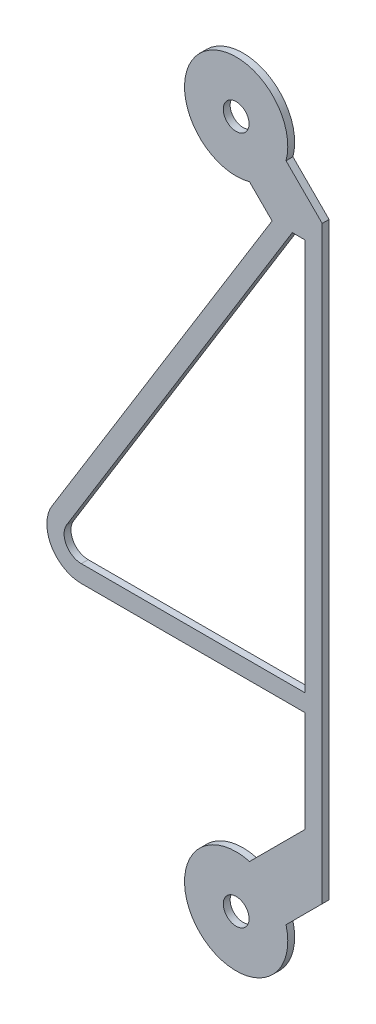
ISO-10303-21;
HEADER;
FILE_DESCRIPTION(('STEP AP214'),'2;1');
FILE_NAME('part.step','',(''),(''),'','','');
FILE_SCHEMA(('AUTOMOTIVE_DESIGN { 1 0 10303 214 1 1 1 1 }'));
ENDSEC;
DATA;
#1=APPLICATION_CONTEXT('core data for automotive mechanical design processes');
#2=APPLICATION_PROTOCOL_DEFINITION('international standard','automotive_design',2000,#1);
#3=PRODUCT_CONTEXT('',#1,'mechanical');
#4=PRODUCT('Part','Part','',(#3));
#5=PRODUCT_RELATED_PRODUCT_CATEGORY('part','',(#4));
#6=PRODUCT_DEFINITION_FORMATION('','',#4);
#7=PRODUCT_DEFINITION_CONTEXT('part definition',#1,'design');
#8=PRODUCT_DEFINITION('design','',#6,#7);
#9=PRODUCT_DEFINITION_SHAPE('','',#8);
#10=(LENGTH_UNIT() NAMED_UNIT(*) SI_UNIT(.MILLI.,.METRE.));
#11=(NAMED_UNIT(*) PLANE_ANGLE_UNIT() SI_UNIT($,.RADIAN.));
#12=(NAMED_UNIT(*) SI_UNIT($,.STERADIAN.) SOLID_ANGLE_UNIT());
#13=UNCERTAINTY_MEASURE_WITH_UNIT(LENGTH_MEASURE(1.E-05),#10,'distance_accuracy_value','');
#14=(GEOMETRIC_REPRESENTATION_CONTEXT(3) GLOBAL_UNCERTAINTY_ASSIGNED_CONTEXT((#13)) GLOBAL_UNIT_ASSIGNED_CONTEXT((#10,
#11,#12)) REPRESENTATION_CONTEXT('',''));
#15=CARTESIAN_POINT('',(0.,0.,0.));
#16=DIRECTION('',(0.,0.,1.));
#17=DIRECTION('',(1.,0.,0.));
#18=AXIS2_PLACEMENT_3D('',#15,#16,#17);
#19=CARTESIAN_POINT('',(0.,-10.,0.1));
#20=DIRECTION('',(0.,0.,1.));
#21=DIRECTION('',(1.,0.,0.));
#22=AXIS2_PLACEMENT_3D('',#19,#20,#21);
#23=PLANE('',#22);
#24=CARTESIAN_POINT('',(0.,10.,0.1));
#25=DIRECTION('',(0.,0.,1.));
#26=DIRECTION('',(1.,0.,0.));
#27=AXIS2_PLACEMENT_3D('',#24,#25,#26);
#28=CIRCLE('',#27,0.375);
#29=CARTESIAN_POINT('',(0.375,10.,0.1));
#30=VERTEX_POINT('',#29);
#31=EDGE_CURVE('E198',#30,#30,#28,.T.);
#32=ORIENTED_EDGE('',*,*,#31,.F.);
#33=EDGE_LOOP('',(#32));
#34=FACE_BOUND('',#33,.T.);
#35=DIRECTION('',(0.,-1.,0.));
#36=VECTOR('',#35,1.);
#37=CARTESIAN_POINT('',(2.,-4.,0.1));
#38=LINE('',#37,#36);
#39=CARTESIAN_POINT('',(2.,-4.,0.1));
#40=VERTEX_POINT('',#39);
#41=CARTESIAN_POINT('',(2.,-6.93933982822024,0.1));
#42=VERTEX_POINT('',#41);
#43=EDGE_CURVE('E204',#40,#42,#38,.T.);
#44=ORIENTED_EDGE('',*,*,#43,.T.);
#45=DIRECTION('',(-0.70710678118655,-0.707106781186545,0.));
#46=VECTOR('',#45,1.);
#47=CARTESIAN_POINT('',(2.,-6.93933982822024,0.1));
#48=LINE('',#47,#46);
#49=CARTESIAN_POINT('',(0.388228567653822,-8.55111126056641,0.1));
#50=VERTEX_POINT('',#49);
#51=EDGE_CURVE('E207',#42,#50,#48,.T.);
#52=ORIENTED_EDGE('',*,*,#51,.T.);
#53=CARTESIAN_POINT('',(0.,-10.,0.1));
#54=DIRECTION('',(0.,0.,1.));
#55=DIRECTION('',(1.,0.,0.));
#56=AXIS2_PLACEMENT_3D('',#53,#54,#55);
#57=CIRCLE('',#56,1.5);
#58=CARTESIAN_POINT('',(1.4488887394336,-9.61177143234619,0.1));
#59=VERTEX_POINT('',#58);
#60=EDGE_CURVE('E210',#50,#59,#57,.T.);
#61=ORIENTED_EDGE('',*,*,#60,.T.);
#62=DIRECTION('',(0.707106781186551,0.707106781186544,0.));
#63=VECTOR('',#62,1.);
#64=CARTESIAN_POINT('',(2.5,-8.5606601717798,0.1));
#65=LINE('',#64,#63);
#66=CARTESIAN_POINT('',(2.5,-8.5606601717798,0.1));
#67=VERTEX_POINT('',#66);
#68=EDGE_CURVE('E212',#59,#67,#65,.T.);
#69=ORIENTED_EDGE('',*,*,#68,.T.);
#70=DIRECTION('',(0.,1.,0.));
#71=VECTOR('',#70,1.);
#72=CARTESIAN_POINT('',(2.5,-8.5606601717798,0.1));
#73=LINE('',#72,#71);
#74=CARTESIAN_POINT('',(2.5,8.5606601717798,0.1));
#75=VERTEX_POINT('',#74);
#76=EDGE_CURVE('E214',#67,#75,#73,.T.);
#77=ORIENTED_EDGE('',*,*,#76,.T.);
#78=DIRECTION('',(-0.707106781186544,0.707106781186551,0.));
#79=VECTOR('',#78,1.);
#80=CARTESIAN_POINT('',(2.5,8.5606601717798,0.1));
#81=LINE('',#80,#79);
#82=CARTESIAN_POINT('',(1.4488887394336,9.61177143234621,0.1));
#83=VERTEX_POINT('',#82);
#84=EDGE_CURVE('E216',#75,#83,#81,.T.);
#85=ORIENTED_EDGE('',*,*,#84,.T.);
#86=CARTESIAN_POINT('',(0.,10.,0.1));
#87=DIRECTION('',(0.,0.,1.));
#88=DIRECTION('',(1.,0.,0.));
#89=AXIS2_PLACEMENT_3D('',#86,#87,#88);
#90=CIRCLE('',#89,1.5);
#91=CARTESIAN_POINT('',(0.388228567653776,8.5511112605664,0.1));
#92=VERTEX_POINT('',#91);
#93=EDGE_CURVE('E218',#83,#92,#90,.T.);
#94=ORIENTED_EDGE('',*,*,#93,.T.);
#95=DIRECTION('',(0.707106781186544,-0.707106781186551,0.));
#96=VECTOR('',#95,1.);
#97=CARTESIAN_POINT('',(1.04409718951556,7.8952426387046,0.1));
#98=LINE('',#97,#96);
#99=CARTESIAN_POINT('',(1.04409718951556,7.8952426387046,0.1));
#100=VERTEX_POINT('',#99);
#101=EDGE_CURVE('E220',#92,#100,#98,.T.);
#102=ORIENTED_EDGE('',*,*,#101,.T.);
#103=DIRECTION('',(-0.524901574807822,-0.851162931972645,0.));
#104=VECTOR('',#103,1.);
#105=CARTESIAN_POINT('',(1.04409718951556,7.8952426387046,0.1));
#106=LINE('',#105,#104);
#107=CARTESIAN_POINT('',(-5.35116293197264,-2.47509842519218,0.1));
#108=VERTEX_POINT('',#107);
#109=EDGE_CURVE('E222',#100,#108,#106,.T.);
#110=ORIENTED_EDGE('',*,*,#109,.T.);
#111=CARTESIAN_POINT('',(-4.5,-3.,0.1));
#112=DIRECTION('',(0.,0.,1.));
#113=DIRECTION('',(1.,0.,0.));
#114=AXIS2_PLACEMENT_3D('',#111,#112,#113);
#115=CIRCLE('',#114,1.);
#116=CARTESIAN_POINT('',(-4.5,-4.,0.1));
#117=VERTEX_POINT('',#116);
#118=EDGE_CURVE('E224',#108,#117,#115,.T.);
#119=ORIENTED_EDGE('',*,*,#118,.T.);
#120=DIRECTION('',(1.,0.,0.));
#121=VECTOR('',#120,1.);
#122=CARTESIAN_POINT('',(-4.5,-4.,0.1));
#123=LINE('',#122,#121);
#124=EDGE_CURVE('E226',#117,#40,#123,.T.);
#125=ORIENTED_EDGE('',*,*,#124,.T.);
#126=EDGE_LOOP('',(#44,#52,#61,#69,#77,#85,#94,#102,#110,#119,#125));
#127=FACE_BOUND('',#126,.T.);
#128=CARTESIAN_POINT('',(0.,-10.,0.1));
#129=DIRECTION('',(0.,0.,1.));
#130=DIRECTION('',(1.,0.,0.));
#131=AXIS2_PLACEMENT_3D('',#128,#129,#130);
#132=CIRCLE('',#131,0.375);
#133=CARTESIAN_POINT('',(0.375000000000006,-10.,0.1));
#134=VERTEX_POINT('',#133);
#135=EDGE_CURVE('E192',#134,#134,#132,.T.);
#136=ORIENTED_EDGE('',*,*,#135,.F.);
#137=EDGE_LOOP('',(#136));
#138=FACE_BOUND('',#137,.T.);
#139=DIRECTION('',(1.,0.,0.));
#140=VECTOR('',#139,1.);
#141=CARTESIAN_POINT('',(-4.5,-3.5,0.1));
#142=LINE('',#141,#140);
#143=CARTESIAN_POINT('',(-4.5,-3.5,0.1));
#144=VERTEX_POINT('',#143);
#145=CARTESIAN_POINT('',(2.,-3.5,0.1));
#146=VERTEX_POINT('',#145);
#147=EDGE_CURVE('E156',#144,#146,#142,.T.);
#148=ORIENTED_EDGE('',*,*,#147,.F.);
#149=CARTESIAN_POINT('',(-4.5,-3.,0.1));
#150=DIRECTION('',(0.,0.,1.));
#151=DIRECTION('',(1.,0.,0.));
#152=AXIS2_PLACEMENT_3D('',#149,#150,#151);
#153=CIRCLE('',#152,0.5);
#154=CARTESIAN_POINT('',(-4.92558146598632,-2.73754921259609,0.1));
#155=VERTEX_POINT('',#154);
#156=EDGE_CURVE('E148',#155,#144,#153,.T.);
#157=ORIENTED_EDGE('',*,*,#156,.F.);
#158=DIRECTION('',(-0.524901574807822,-0.851162931972645,0.));
#159=VECTOR('',#158,1.);
#160=CARTESIAN_POINT('',(1.63152878600345,7.8952426387046,0.1));
#161=LINE('',#160,#159);
#162=CARTESIAN_POINT('',(1.63152878600345,7.8952426387046,0.1));
#163=VERTEX_POINT('',#162);
#164=EDGE_CURVE('E175',#163,#155,#161,.T.);
#165=ORIENTED_EDGE('',*,*,#164,.F.);
#166=DIRECTION('',(-1.,0.,0.));
#167=VECTOR('',#166,1.);
#168=CARTESIAN_POINT('',(1.63152878600345,7.8952426387046,0.1));
#169=LINE('',#168,#167);
#170=CARTESIAN_POINT('',(2.,7.8952426387046,0.1));
#171=VERTEX_POINT('',#170);
#172=EDGE_CURVE('E171',#171,#163,#169,.T.);
#173=ORIENTED_EDGE('',*,*,#172,.F.);
#174=DIRECTION('',(0.,1.,0.));
#175=VECTOR('',#174,1.);
#176=CARTESIAN_POINT('',(2.,-3.5,0.1));
#177=LINE('',#176,#175);
#178=EDGE_CURVE('E169',#146,#171,#177,.T.);
#179=ORIENTED_EDGE('',*,*,#178,.F.);
#180=EDGE_LOOP('',(#148,#157,#165,#173,#179));
#181=FACE_BOUND('',#180,.T.);
#182=ADVANCED_FACE('F35',(#34,#127,#138,#181),#23,.T.);
#183=CARTESIAN_POINT('',(0.,-10.,-0.1));
#184=DIRECTION('',(0.,0.,1.));
#185=DIRECTION('',(1.,0.,0.));
#186=AXIS2_PLACEMENT_3D('',#183,#184,#185);
#187=PLANE('',#186);
#188=CARTESIAN_POINT('',(0.,-10.,-0.1));
#189=DIRECTION('',(0.,0.,1.));
#190=DIRECTION('',(1.,0.,0.));
#191=AXIS2_PLACEMENT_3D('',#188,#189,#190);
#192=CIRCLE('',#191,0.375);
#193=CARTESIAN_POINT('',(0.375000000000006,-10.,-0.1));
#194=VERTEX_POINT('',#193);
#195=EDGE_CURVE('E164',#194,#194,#192,.T.);
#196=ORIENTED_EDGE('',*,*,#195,.T.);
#197=EDGE_LOOP('',(#196));
#198=FACE_BOUND('',#197,.T.);
#199=CARTESIAN_POINT('',(0.,10.,-0.1));
#200=DIRECTION('',(0.,0.,1.));
#201=DIRECTION('',(1.,0.,0.));
#202=AXIS2_PLACEMENT_3D('',#199,#200,#201);
#203=CIRCLE('',#202,0.375);
#204=CARTESIAN_POINT('',(0.375,10.,-0.1));
#205=VERTEX_POINT('',#204);
#206=EDGE_CURVE('E195',#205,#205,#203,.T.);
#207=ORIENTED_EDGE('',*,*,#206,.T.);
#208=EDGE_LOOP('',(#207));
#209=FACE_BOUND('',#208,.T.);
#210=DIRECTION('',(0.,-1.,0.));
#211=VECTOR('',#210,1.);
#212=CARTESIAN_POINT('',(2.,-4.,-0.1));
#213=LINE('',#212,#211);
#214=CARTESIAN_POINT('',(2.,-4.,-0.1));
#215=VERTEX_POINT('',#214);
#216=CARTESIAN_POINT('',(2.,-6.93933982822024,-0.1));
#217=VERTEX_POINT('',#216);
#218=EDGE_CURVE('E201',#215,#217,#213,.T.);
#219=ORIENTED_EDGE('',*,*,#218,.F.);
#220=DIRECTION('',(1.,0.,0.));
#221=VECTOR('',#220,1.);
#222=CARTESIAN_POINT('',(-4.5,-4.,-0.1));
#223=LINE('',#222,#221);
#224=CARTESIAN_POINT('',(-4.5,-4.,-0.1));
#225=VERTEX_POINT('',#224);
#226=EDGE_CURVE('E208',#225,#215,#223,.T.);
#227=ORIENTED_EDGE('',*,*,#226,.F.);
#228=CARTESIAN_POINT('',(-4.5,-3.,-0.1));
#229=DIRECTION('',(0.,0.,1.));
#230=DIRECTION('',(1.,0.,0.));
#231=AXIS2_PLACEMENT_3D('',#228,#229,#230);
#232=CIRCLE('',#231,1.);
#233=CARTESIAN_POINT('',(-5.35116293197264,-2.47509842519218,-0.1));
#234=VERTEX_POINT('',#233);
#235=EDGE_CURVE('E247',#234,#225,#232,.T.);
#236=ORIENTED_EDGE('',*,*,#235,.F.);
#237=DIRECTION('',(-0.524901574807822,-0.851162931972645,0.));
#238=VECTOR('',#237,1.);
#239=CARTESIAN_POINT('',(1.04409718951556,7.8952426387046,-0.1));
#240=LINE('',#239,#238);
#241=CARTESIAN_POINT('',(1.04409718951556,7.8952426387046,-0.1));
#242=VERTEX_POINT('',#241);
#243=EDGE_CURVE('E245',#242,#234,#240,.T.);
#244=ORIENTED_EDGE('',*,*,#243,.F.);
#245=DIRECTION('',(0.707106781186544,-0.707106781186551,0.));
#246=VECTOR('',#245,1.);
#247=CARTESIAN_POINT('',(1.04409718951556,7.8952426387046,-0.1));
#248=LINE('',#247,#246);
#249=CARTESIAN_POINT('',(0.388228567653776,8.5511112605664,-0.1));
#250=VERTEX_POINT('',#249);
#251=EDGE_CURVE('E243',#250,#242,#248,.T.);
#252=ORIENTED_EDGE('',*,*,#251,.F.);
#253=CARTESIAN_POINT('',(0.,10.,-0.1));
#254=DIRECTION('',(0.,0.,1.));
#255=DIRECTION('',(1.,0.,0.));
#256=AXIS2_PLACEMENT_3D('',#253,#254,#255);
#257=CIRCLE('',#256,1.5);
#258=CARTESIAN_POINT('',(1.4488887394336,9.61177143234621,-0.1));
#259=VERTEX_POINT('',#258);
#260=EDGE_CURVE('E241',#259,#250,#257,.T.);
#261=ORIENTED_EDGE('',*,*,#260,.F.);
#262=DIRECTION('',(-0.707106781186544,0.707106781186551,0.));
#263=VECTOR('',#262,1.);
#264=CARTESIAN_POINT('',(2.5,8.5606601717798,-0.1));
#265=LINE('',#264,#263);
#266=CARTESIAN_POINT('',(2.5,8.5606601717798,-0.1));
#267=VERTEX_POINT('',#266);
#268=EDGE_CURVE('E239',#267,#259,#265,.T.);
#269=ORIENTED_EDGE('',*,*,#268,.F.);
#270=DIRECTION('',(0.,1.,0.));
#271=VECTOR('',#270,1.);
#272=CARTESIAN_POINT('',(2.5,-8.5606601717798,-0.1));
#273=LINE('',#272,#271);
#274=CARTESIAN_POINT('',(2.5,-8.5606601717798,-0.1));
#275=VERTEX_POINT('',#274);
#276=EDGE_CURVE('E237',#275,#267,#273,.T.);
#277=ORIENTED_EDGE('',*,*,#276,.F.);
#278=DIRECTION('',(0.707106781186551,0.707106781186544,0.));
#279=VECTOR('',#278,1.);
#280=CARTESIAN_POINT('',(2.5,-8.5606601717798,-0.1));
#281=LINE('',#280,#279);
#282=CARTESIAN_POINT('',(1.4488887394336,-9.61177143234619,-0.1));
#283=VERTEX_POINT('',#282);
#284=EDGE_CURVE('E235',#283,#275,#281,.T.);
#285=ORIENTED_EDGE('',*,*,#284,.F.);
#286=CARTESIAN_POINT('',(0.,-10.,-0.1));
#287=DIRECTION('',(0.,0.,1.));
#288=DIRECTION('',(1.,0.,0.));
#289=AXIS2_PLACEMENT_3D('',#286,#287,#288);
#290=CIRCLE('',#289,1.5);
#291=CARTESIAN_POINT('',(0.388228567653822,-8.55111126056641,-0.1));
#292=VERTEX_POINT('',#291);
#293=EDGE_CURVE('E233',#292,#283,#290,.T.);
#294=ORIENTED_EDGE('',*,*,#293,.F.);
#295=DIRECTION('',(-0.70710678118655,-0.707106781186545,0.));
#296=VECTOR('',#295,1.);
#297=CARTESIAN_POINT('',(2.,-6.93933982822024,-0.1));
#298=LINE('',#297,#296);
#299=EDGE_CURVE('E231',#217,#292,#298,.T.);
#300=ORIENTED_EDGE('',*,*,#299,.F.);
#301=EDGE_LOOP('',(#219,#227,#236,#244,#252,#261,#269,#277,#285,#294,#300));
#302=FACE_BOUND('',#301,.T.);
#303=CARTESIAN_POINT('',(-4.5,-3.,-0.1));
#304=DIRECTION('',(0.,0.,1.));
#305=DIRECTION('',(1.,0.,0.));
#306=AXIS2_PLACEMENT_3D('',#303,#304,#305);
#307=CIRCLE('',#306,0.5);
#308=CARTESIAN_POINT('',(-4.92558146598632,-2.73754921259609,-0.1));
#309=VERTEX_POINT('',#308);
#310=CARTESIAN_POINT('',(-4.5,-3.5,-0.1));
#311=VERTEX_POINT('',#310);
#312=EDGE_CURVE('E58',#309,#311,#307,.T.);
#313=ORIENTED_EDGE('',*,*,#312,.T.);
#314=DIRECTION('',(1.,0.,0.));
#315=VECTOR('',#314,1.);
#316=CARTESIAN_POINT('',(-4.5,-3.5,-0.1));
#317=LINE('',#316,#315);
#318=CARTESIAN_POINT('',(2.,-3.5,-0.1));
#319=VERTEX_POINT('',#318);
#320=EDGE_CURVE('E163',#311,#319,#317,.T.);
#321=ORIENTED_EDGE('',*,*,#320,.T.);
#322=DIRECTION('',(0.,1.,0.));
#323=VECTOR('',#322,1.);
#324=CARTESIAN_POINT('',(2.,-3.5,-0.1));
#325=LINE('',#324,#323);
#326=CARTESIAN_POINT('',(2.,7.8952426387046,-0.1));
#327=VERTEX_POINT('',#326);
#328=EDGE_CURVE('E179',#319,#327,#325,.T.);
#329=ORIENTED_EDGE('',*,*,#328,.T.);
#330=DIRECTION('',(-1.,0.,0.));
#331=VECTOR('',#330,1.);
#332=CARTESIAN_POINT('',(1.63152878600345,7.8952426387046,-0.1));
#333=LINE('',#332,#331);
#334=CARTESIAN_POINT('',(1.63152878600345,7.8952426387046,-0.1));
#335=VERTEX_POINT('',#334);
#336=EDGE_CURVE('E182',#327,#335,#333,.T.);
#337=ORIENTED_EDGE('',*,*,#336,.T.);
#338=DIRECTION('',(-0.524901574807822,-0.851162931972645,0.));
#339=VECTOR('',#338,1.);
#340=CARTESIAN_POINT('',(1.63152878600345,7.8952426387046,-0.1));
#341=LINE('',#340,#339);
#342=EDGE_CURVE('E157',#335,#309,#341,.T.);
#343=ORIENTED_EDGE('',*,*,#342,.T.);
#344=EDGE_LOOP('',(#313,#321,#329,#337,#343));
#345=FACE_BOUND('',#344,.T.);
#346=ADVANCED_FACE('F286',(#198,#209,#302,#345),#187,.F.);
#347=CARTESIAN_POINT('',(2.,-4.,0.1));
#348=DIRECTION('',(1.,0.,0.));
#349=DIRECTION('',(0.,0.,-1.));
#350=AXIS2_PLACEMENT_3D('',#347,#348,#349);
#351=PLANE('',#350);
#352=ORIENTED_EDGE('',*,*,#218,.T.);
#353=DIRECTION('',(0.,0.,-1.));
#354=VECTOR('',#353,1.);
#355=CARTESIAN_POINT('',(2.,-6.93933982822024,0.1));
#356=LINE('',#355,#354);
#357=EDGE_CURVE('E11',#42,#217,#356,.T.);
#358=ORIENTED_EDGE('',*,*,#357,.F.);
#359=ORIENTED_EDGE('',*,*,#43,.F.);
#360=DIRECTION('',(0.,0.,-1.));
#361=VECTOR('',#360,1.);
#362=CARTESIAN_POINT('',(2.,-4.,0.1));
#363=LINE('',#362,#361);
#364=EDGE_CURVE('E228',#40,#215,#363,.T.);
#365=ORIENTED_EDGE('',*,*,#364,.T.);
#366=EDGE_LOOP('',(#352,#358,#359,#365));
#367=FACE_BOUND('',#366,.T.);
#368=ADVANCED_FACE('F37',(#367),#351,.F.);
#369=CARTESIAN_POINT('',(2.,-6.93933982822024,0.1));
#370=DIRECTION('',(0.707106781186545,-0.70710678118655,0.));
#371=DIRECTION('',(0.70710678118655,0.707106781186545,0.));
#372=AXIS2_PLACEMENT_3D('',#369,#370,#371);
#373=PLANE('',#372);
#374=ORIENTED_EDGE('',*,*,#299,.T.);
#375=DIRECTION('',(0.,0.,-1.));
#376=VECTOR('',#375,1.);
#377=CARTESIAN_POINT('',(0.388228567653822,-8.55111126056641,0.1));
#378=LINE('',#377,#376);
#379=EDGE_CURVE('E43',#50,#292,#378,.T.);
#380=ORIENTED_EDGE('',*,*,#379,.F.);
#381=ORIENTED_EDGE('',*,*,#51,.F.);
#382=ORIENTED_EDGE('',*,*,#357,.T.);
#383=EDGE_LOOP('',(#374,#380,#381,#382));
#384=FACE_BOUND('',#383,.T.);
#385=ADVANCED_FACE('F304',(#384),#373,.F.);
#386=CARTESIAN_POINT('',(0.,-10.,0.1));
#387=DIRECTION('',(0.,0.,-1.));
#388=DIRECTION('',(-1.,0.,0.));
#389=AXIS2_PLACEMENT_3D('',#386,#387,#388);
#390=CYLINDRICAL_SURFACE('',#389,1.5);
#391=ORIENTED_EDGE('',*,*,#293,.T.);
#392=DIRECTION('',(0.,0.,-1.));
#393=VECTOR('',#392,1.);
#394=CARTESIAN_POINT('',(1.4488887394336,-9.61177143234619,0.1));
#395=LINE('',#394,#393);
#396=EDGE_CURVE('E273',#59,#283,#395,.T.);
#397=ORIENTED_EDGE('',*,*,#396,.F.);
#398=ORIENTED_EDGE('',*,*,#60,.F.);
#399=ORIENTED_EDGE('',*,*,#379,.T.);
#400=EDGE_LOOP('',(#391,#397,#398,#399));
#401=FACE_BOUND('',#400,.T.);
#402=ADVANCED_FACE('F280',(#401),#390,.T.);
#403=CARTESIAN_POINT('',(2.5,-8.5606601717798,0.1));
#404=DIRECTION('',(-0.707106781186544,0.707106781186551,0.));
#405=DIRECTION('',(-0.707106781186551,-0.707106781186544,0.));
#406=AXIS2_PLACEMENT_3D('',#403,#404,#405);
#407=PLANE('',#406);
#408=ORIENTED_EDGE('',*,*,#284,.T.);
#409=DIRECTION('',(0.,0.,-1.));
#410=VECTOR('',#409,1.);
#411=CARTESIAN_POINT('',(2.5,-8.5606601717798,0.1));
#412=LINE('',#411,#410);
#413=EDGE_CURVE('E270',#67,#275,#412,.T.);
#414=ORIENTED_EDGE('',*,*,#413,.F.);
#415=ORIENTED_EDGE('',*,*,#68,.F.);
#416=ORIENTED_EDGE('',*,*,#396,.T.);
#417=EDGE_LOOP('',(#408,#414,#415,#416));
#418=FACE_BOUND('',#417,.T.);
#419=ADVANCED_FACE('F292',(#418),#407,.F.);
#420=CARTESIAN_POINT('',(2.5,-8.5606601717798,0.1));
#421=DIRECTION('',(-1.,0.,0.));
#422=DIRECTION('',(0.,0.,1.));
#423=AXIS2_PLACEMENT_3D('',#420,#421,#422);
#424=PLANE('',#423);
#425=ORIENTED_EDGE('',*,*,#276,.T.);
#426=DIRECTION('',(0.,0.,-1.));
#427=VECTOR('',#426,1.);
#428=CARTESIAN_POINT('',(2.5,8.5606601717798,0.1));
#429=LINE('',#428,#427);
#430=EDGE_CURVE('E267',#75,#267,#429,.T.);
#431=ORIENTED_EDGE('',*,*,#430,.F.);
#432=ORIENTED_EDGE('',*,*,#76,.F.);
#433=ORIENTED_EDGE('',*,*,#413,.T.);
#434=EDGE_LOOP('',(#425,#431,#432,#433));
#435=FACE_BOUND('',#434,.T.);
#436=ADVANCED_FACE('F296',(#435),#424,.F.);
#437=CARTESIAN_POINT('',(2.5,8.5606601717798,0.1));
#438=DIRECTION('',(-0.707106781186551,-0.707106781186544,0.));
#439=DIRECTION('',(0.707106781186544,-0.707106781186551,0.));
#440=AXIS2_PLACEMENT_3D('',#437,#438,#439);
#441=PLANE('',#440);
#442=ORIENTED_EDGE('',*,*,#268,.T.);
#443=DIRECTION('',(0.,0.,-1.));
#444=VECTOR('',#443,1.);
#445=CARTESIAN_POINT('',(1.4488887394336,9.61177143234621,0.1));
#446=LINE('',#445,#444);
#447=EDGE_CURVE('E264',#83,#259,#446,.T.);
#448=ORIENTED_EDGE('',*,*,#447,.F.);
#449=ORIENTED_EDGE('',*,*,#84,.F.);
#450=ORIENTED_EDGE('',*,*,#430,.T.);
#451=EDGE_LOOP('',(#442,#448,#449,#450));
#452=FACE_BOUND('',#451,.T.);
#453=ADVANCED_FACE('F332',(#452),#441,.F.);
#454=CARTESIAN_POINT('',(0.,10.,0.1));
#455=DIRECTION('',(0.,0.,-1.));
#456=DIRECTION('',(-1.,0.,0.));
#457=AXIS2_PLACEMENT_3D('',#454,#455,#456);
#458=CYLINDRICAL_SURFACE('',#457,1.5);
#459=ORIENTED_EDGE('',*,*,#260,.T.);
#460=DIRECTION('',(0.,0.,-1.));
#461=VECTOR('',#460,1.);
#462=CARTESIAN_POINT('',(0.388228567653776,8.5511112605664,0.1));
#463=LINE('',#462,#461);
#464=EDGE_CURVE('E261',#92,#250,#463,.T.);
#465=ORIENTED_EDGE('',*,*,#464,.F.);
#466=ORIENTED_EDGE('',*,*,#93,.F.);
#467=ORIENTED_EDGE('',*,*,#447,.T.);
#468=EDGE_LOOP('',(#459,#465,#466,#467));
#469=FACE_BOUND('',#468,.T.);
#470=ADVANCED_FACE('F330',(#469),#458,.T.);
#471=CARTESIAN_POINT('',(1.04409718951556,7.8952426387046,0.1));
#472=DIRECTION('',(0.707106781186551,0.707106781186544,0.));
#473=DIRECTION('',(-0.707106781186544,0.707106781186551,0.));
#474=AXIS2_PLACEMENT_3D('',#471,#472,#473);
#475=PLANE('',#474);
#476=ORIENTED_EDGE('',*,*,#251,.T.);
#477=DIRECTION('',(0.,0.,-1.));
#478=VECTOR('',#477,1.);
#479=CARTESIAN_POINT('',(1.04409718951556,7.8952426387046,0.1));
#480=LINE('',#479,#478);
#481=EDGE_CURVE('E258',#100,#242,#480,.T.);
#482=ORIENTED_EDGE('',*,*,#481,.F.);
#483=ORIENTED_EDGE('',*,*,#101,.F.);
#484=ORIENTED_EDGE('',*,*,#464,.T.);
#485=EDGE_LOOP('',(#476,#482,#483,#484));
#486=FACE_BOUND('',#485,.T.);
#487=ADVANCED_FACE('F325',(#486),#475,.F.);
#488=CARTESIAN_POINT('',(1.04409718951556,7.8952426387046,0.1));
#489=DIRECTION('',(0.851162931972645,-0.524901574807821,0.));
#490=DIRECTION('',(0.524901574807822,0.851162931972645,0.));
#491=AXIS2_PLACEMENT_3D('',#488,#489,#490);
#492=PLANE('',#491);
#493=ORIENTED_EDGE('',*,*,#243,.T.);
#494=DIRECTION('',(0.,0.,-1.));
#495=VECTOR('',#494,1.);
#496=CARTESIAN_POINT('',(-5.35116293197264,-2.47509842519218,0.1));
#497=LINE('',#496,#495);
#498=EDGE_CURVE('E255',#108,#234,#497,.T.);
#499=ORIENTED_EDGE('',*,*,#498,.F.);
#500=ORIENTED_EDGE('',*,*,#109,.F.);
#501=ORIENTED_EDGE('',*,*,#481,.T.);
#502=EDGE_LOOP('',(#493,#499,#500,#501));
#503=FACE_BOUND('',#502,.T.);
#504=ADVANCED_FACE('F320',(#503),#492,.F.);
#505=CARTESIAN_POINT('',(-4.5,-3.,0.1));
#506=DIRECTION('',(0.,0.,-1.));
#507=DIRECTION('',(-1.,0.,0.));
#508=AXIS2_PLACEMENT_3D('',#505,#506,#507);
#509=CYLINDRICAL_SURFACE('',#508,1.);
#510=ORIENTED_EDGE('',*,*,#235,.T.);
#511=DIRECTION('',(0.,0.,-1.));
#512=VECTOR('',#511,1.);
#513=CARTESIAN_POINT('',(-4.5,-4.,0.1));
#514=LINE('',#513,#512);
#515=EDGE_CURVE('E252',#117,#225,#514,.T.);
#516=ORIENTED_EDGE('',*,*,#515,.F.);
#517=ORIENTED_EDGE('',*,*,#118,.F.);
#518=ORIENTED_EDGE('',*,*,#498,.T.);
#519=EDGE_LOOP('',(#510,#516,#517,#518));
#520=FACE_BOUND('',#519,.T.);
#521=ADVANCED_FACE('F316',(#520),#509,.T.);
#522=CARTESIAN_POINT('',(-4.5,-4.,0.1));
#523=DIRECTION('',(0.,1.,0.));
#524=DIRECTION('',(0.,0.,1.));
#525=AXIS2_PLACEMENT_3D('',#522,#523,#524);
#526=PLANE('',#525);
#527=ORIENTED_EDGE('',*,*,#226,.T.);
#528=ORIENTED_EDGE('',*,*,#364,.F.);
#529=ORIENTED_EDGE('',*,*,#124,.F.);
#530=ORIENTED_EDGE('',*,*,#515,.T.);
#531=EDGE_LOOP('',(#527,#528,#529,#530));
#532=FACE_BOUND('',#531,.T.);
#533=ADVANCED_FACE('F311',(#532),#526,.F.);
#534=CARTESIAN_POINT('',(0.,10.,0.1));
#535=DIRECTION('',(0.,0.,-1.));
#536=DIRECTION('',(-1.,0.,0.));
#537=AXIS2_PLACEMENT_3D('',#534,#535,#536);
#538=CYLINDRICAL_SURFACE('',#537,0.375);
#539=ORIENTED_EDGE('',*,*,#31,.T.);
#540=EDGE_LOOP('',(#539));
#541=FACE_BOUND('',#540,.T.);
#542=ORIENTED_EDGE('',*,*,#206,.F.);
#543=EDGE_LOOP('',(#542));
#544=FACE_BOUND('',#543,.T.);
#545=ADVANCED_FACE('F351',(#541,#544),#538,.F.);
#546=CARTESIAN_POINT('',(0.,-10.,0.1));
#547=DIRECTION('',(0.,0.,-1.));
#548=DIRECTION('',(-1.,0.,0.));
#549=AXIS2_PLACEMENT_3D('',#546,#547,#548);
#550=CYLINDRICAL_SURFACE('',#549,0.375);
#551=ORIENTED_EDGE('',*,*,#135,.T.);
#552=EDGE_LOOP('',(#551));
#553=FACE_BOUND('',#552,.T.);
#554=ORIENTED_EDGE('',*,*,#195,.F.);
#555=EDGE_LOOP('',(#554));
#556=FACE_BOUND('',#555,.T.);
#557=ADVANCED_FACE('F383',(#553,#556),#550,.F.);
#558=CARTESIAN_POINT('',(-4.5,-3.,0.1));
#559=DIRECTION('',(0.,0.,-1.));
#560=DIRECTION('',(-1.,0.,0.));
#561=AXIS2_PLACEMENT_3D('',#558,#559,#560);
#562=CYLINDRICAL_SURFACE('',#561,0.5);
#563=ORIENTED_EDGE('',*,*,#312,.F.);
#564=DIRECTION('',(0.,0.,-1.));
#565=VECTOR('',#564,1.);
#566=CARTESIAN_POINT('',(-4.92558146598632,-2.73754921259609,0.1));
#567=LINE('',#566,#565);
#568=EDGE_CURVE('E152',#155,#309,#567,.T.);
#569=ORIENTED_EDGE('',*,*,#568,.F.);
#570=ORIENTED_EDGE('',*,*,#156,.T.);
#571=DIRECTION('',(0.,0.,-1.));
#572=VECTOR('',#571,1.);
#573=CARTESIAN_POINT('',(-4.5,-3.5,0.1));
#574=LINE('',#573,#572);
#575=EDGE_CURVE('E151',#144,#311,#574,.T.);
#576=ORIENTED_EDGE('',*,*,#575,.T.);
#577=EDGE_LOOP('',(#563,#569,#570,#576));
#578=FACE_BOUND('',#577,.T.);
#579=ADVANCED_FACE('F150',(#578),#562,.F.);
#580=CARTESIAN_POINT('',(-4.5,-3.5,0.1));
#581=DIRECTION('',(0.,1.,0.));
#582=DIRECTION('',(0.,0.,1.));
#583=AXIS2_PLACEMENT_3D('',#580,#581,#582);
#584=PLANE('',#583);
#585=ORIENTED_EDGE('',*,*,#320,.F.);
#586=ORIENTED_EDGE('',*,*,#575,.F.);
#587=ORIENTED_EDGE('',*,*,#147,.T.);
#588=DIRECTION('',(0.,0.,-1.));
#589=VECTOR('',#588,1.);
#590=CARTESIAN_POINT('',(2.,-3.5,0.1));
#591=LINE('',#590,#589);
#592=EDGE_CURVE('E165',#146,#319,#591,.T.);
#593=ORIENTED_EDGE('',*,*,#592,.T.);
#594=EDGE_LOOP('',(#585,#586,#587,#593));
#595=FACE_BOUND('',#594,.T.);
#596=ADVANCED_FACE('F160',(#595),#584,.T.);
#597=CARTESIAN_POINT('',(2.,-3.5,0.1));
#598=DIRECTION('',(-1.,0.,0.));
#599=DIRECTION('',(0.,-1.,0.));
#600=AXIS2_PLACEMENT_3D('',#597,#598,#599);
#601=PLANE('',#600);
#602=ORIENTED_EDGE('',*,*,#328,.F.);
#603=ORIENTED_EDGE('',*,*,#592,.F.);
#604=ORIENTED_EDGE('',*,*,#178,.T.);
#605=DIRECTION('',(0.,0.,-1.));
#606=VECTOR('',#605,1.);
#607=CARTESIAN_POINT('',(2.,7.8952426387046,0.1));
#608=LINE('',#607,#606);
#609=EDGE_CURVE('E189',#171,#327,#608,.T.);
#610=ORIENTED_EDGE('',*,*,#609,.T.);
#611=EDGE_LOOP('',(#602,#603,#604,#610));
#612=FACE_BOUND('',#611,.T.);
#613=ADVANCED_FACE('F402',(#612),#601,.T.);
#614=CARTESIAN_POINT('',(1.63152878600345,7.8952426387046,0.1));
#615=DIRECTION('',(0.,-1.,0.));
#616=DIRECTION('',(0.,0.,-1.));
#617=AXIS2_PLACEMENT_3D('',#614,#615,#616);
#618=PLANE('',#617);
#619=ORIENTED_EDGE('',*,*,#336,.F.);
#620=ORIENTED_EDGE('',*,*,#609,.F.);
#621=ORIENTED_EDGE('',*,*,#172,.T.);
#622=DIRECTION('',(0.,0.,-1.));
#623=VECTOR('',#622,1.);
#624=CARTESIAN_POINT('',(1.63152878600345,7.8952426387046,0.1));
#625=LINE('',#624,#623);
#626=EDGE_CURVE('E50',#163,#335,#625,.T.);
#627=ORIENTED_EDGE('',*,*,#626,.T.);
#628=EDGE_LOOP('',(#619,#620,#621,#627));
#629=FACE_BOUND('',#628,.T.);
#630=ADVANCED_FACE('F409',(#629),#618,.T.);
#631=CARTESIAN_POINT('',(1.63152878600345,7.8952426387046,0.1));
#632=DIRECTION('',(0.851162931972645,-0.524901574807821,0.));
#633=DIRECTION('',(0.524901574807821,0.851162931972645,0.));
#634=AXIS2_PLACEMENT_3D('',#631,#632,#633);
#635=PLANE('',#634);
#636=ORIENTED_EDGE('',*,*,#342,.F.);
#637=ORIENTED_EDGE('',*,*,#626,.F.);
#638=ORIENTED_EDGE('',*,*,#164,.T.);
#639=ORIENTED_EDGE('',*,*,#568,.T.);
#640=EDGE_LOOP('',(#636,#637,#638,#639));
#641=FACE_BOUND('',#640,.T.);
#642=ADVANCED_FACE('F417',(#641),#635,.T.);
#643=CLOSED_SHELL('',(#182,#346,#368,#385,#402,#419,#436,#453,#470,#487,#504,#521,#533,#545,
#557,#579,#596,#613,#630,#642));
#644=MANIFOLD_SOLID_BREP('B2',#643);
#645=ADVANCED_BREP_SHAPE_REPRESENTATION('',(#18,#644),#14);
#646=SHAPE_DEFINITION_REPRESENTATION(#9,#645);
ENDSEC;
END-ISO-10303-21;
